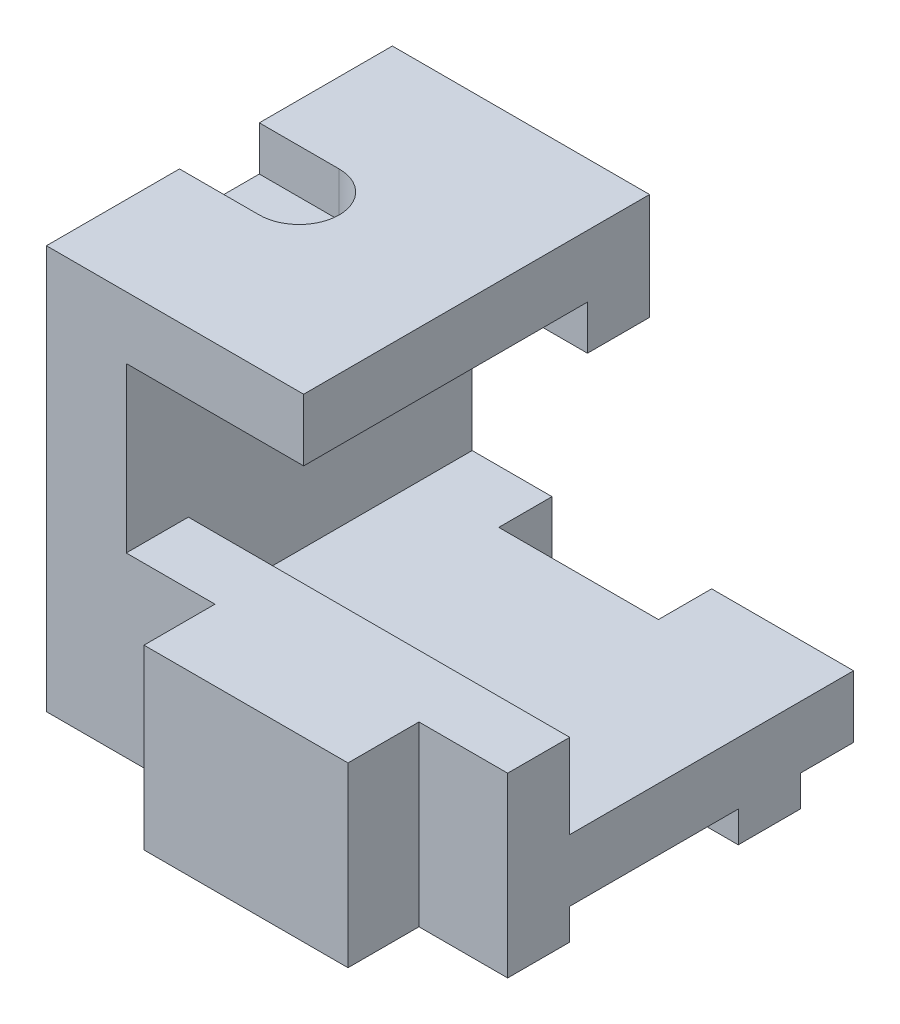
ISO-10303-21;
HEADER;
FILE_DESCRIPTION(('STEP AP214'),'2;1');
FILE_NAME('part.step','',(''),(''),'','','');
FILE_SCHEMA(('AUTOMOTIVE_DESIGN { 1 0 10303 214 1 1 1 1 }'));
ENDSEC;
DATA;
#1=APPLICATION_CONTEXT('core data for automotive mechanical design processes');
#2=APPLICATION_PROTOCOL_DEFINITION('international standard','automotive_design',2000,#1);
#3=PRODUCT_CONTEXT('',#1,'mechanical');
#4=PRODUCT('Part','Part','',(#3));
#5=PRODUCT_RELATED_PRODUCT_CATEGORY('part','',(#4));
#6=PRODUCT_DEFINITION_FORMATION('','',#4);
#7=PRODUCT_DEFINITION_CONTEXT('part definition',#1,'design');
#8=PRODUCT_DEFINITION('design','',#6,#7);
#9=PRODUCT_DEFINITION_SHAPE('','',#8);
#10=(LENGTH_UNIT() NAMED_UNIT(*) SI_UNIT(.MILLI.,.METRE.));
#11=(NAMED_UNIT(*) PLANE_ANGLE_UNIT() SI_UNIT($,.RADIAN.));
#12=(NAMED_UNIT(*) SI_UNIT($,.STERADIAN.) SOLID_ANGLE_UNIT());
#13=UNCERTAINTY_MEASURE_WITH_UNIT(LENGTH_MEASURE(1.E-05),#10,'distance_accuracy_value','');
#14=(GEOMETRIC_REPRESENTATION_CONTEXT(3) GLOBAL_UNCERTAINTY_ASSIGNED_CONTEXT((#13)) GLOBAL_UNIT_ASSIGNED_CONTEXT((#10,
#11,#12)) REPRESENTATION_CONTEXT('',''));
#15=CARTESIAN_POINT('',(0.,0.,0.));
#16=DIRECTION('',(0.,0.,1.));
#17=DIRECTION('',(1.,0.,0.));
#18=AXIS2_PLACEMENT_3D('',#15,#16,#17);
#19=CARTESIAN_POINT('',(7.00000000000001,0.,39.));
#20=DIRECTION('',(-1.,0.,0.));
#21=DIRECTION('',(0.,-1.,0.));
#22=AXIS2_PLACEMENT_3D('',#19,#20,#21);
#23=PLANE('',#22);
#24=DIRECTION('',(0.,0.,1.));
#25=VECTOR('',#24,1.);
#26=CARTESIAN_POINT('',(7.,9.5,32.));
#27=LINE('',#26,#25);
#28=CARTESIAN_POINT('',(7.,9.5,32.));
#29=VERTEX_POINT('',#28);
#30=CARTESIAN_POINT('',(7.,9.5,39.));
#31=VERTEX_POINT('',#30);
#32=EDGE_CURVE('E247',#29,#31,#27,.T.);
#33=ORIENTED_EDGE('',*,*,#32,.F.);
#34=DIRECTION('',(0.,-1.,0.));
#35=VECTOR('',#34,1.);
#36=CARTESIAN_POINT('',(7.00000000000001,0.,32.));
#37=LINE('',#36,#35);
#38=CARTESIAN_POINT('',(7.00000000000001,0.,32.));
#39=VERTEX_POINT('',#38);
#40=EDGE_CURVE('E11',#29,#39,#37,.T.);
#41=ORIENTED_EDGE('',*,*,#40,.T.);
#42=DIRECTION('',(0.,0.,-1.));
#43=VECTOR('',#42,1.);
#44=CARTESIAN_POINT('',(7.00000000000001,0.,39.));
#45=LINE('',#44,#43);
#46=CARTESIAN_POINT('',(7.00000000000001,0.,0.));
#47=VERTEX_POINT('',#46);
#48=EDGE_CURVE('E435',#39,#47,#45,.T.);
#49=ORIENTED_EDGE('',*,*,#48,.T.);
#50=DIRECTION('',(0.,1.,0.));
#51=VECTOR('',#50,1.);
#52=CARTESIAN_POINT('',(7.00000000000001,0.,0.));
#53=LINE('',#52,#51);
#54=CARTESIAN_POINT('',(7.,23.,0.));
#55=VERTEX_POINT('',#54);
#56=EDGE_CURVE('E404',#47,#55,#53,.T.);
#57=ORIENTED_EDGE('',*,*,#56,.T.);
#58=DIRECTION('',(0.,0.,-1.));
#59=VECTOR('',#58,1.);
#60=CARTESIAN_POINT('',(7.000000000005,23.,0.));
#61=LINE('',#60,#59);
#62=CARTESIAN_POINT('',(7.,23.,7.00000000000001));
#63=VERTEX_POINT('',#62);
#64=EDGE_CURVE('E363',#63,#55,#61,.T.);
#65=ORIENTED_EDGE('',*,*,#64,.F.);
#66=DIRECTION('',(0.,-1.,0.));
#67=VECTOR('',#66,1.);
#68=CARTESIAN_POINT('',(7.000000000005,28.0000000000744,7.00000000000001));
#69=LINE('',#68,#67);
#70=CARTESIAN_POINT('',(7.,28.,7.00000000000001));
#71=VERTEX_POINT('',#70);
#72=EDGE_CURVE('E360',#71,#63,#69,.T.);
#73=ORIENTED_EDGE('',*,*,#72,.F.);
#74=DIRECTION('',(0.,0.,-1.));
#75=VECTOR('',#74,1.);
#76=CARTESIAN_POINT('',(7.,28.,39.));
#77=LINE('',#76,#75);
#78=CARTESIAN_POINT('',(7.,28.,39.));
#79=VERTEX_POINT('',#78);
#80=EDGE_CURVE('E432',#79,#71,#77,.T.);
#81=ORIENTED_EDGE('',*,*,#80,.F.);
#82=DIRECTION('',(0.,1.,0.));
#83=VECTOR('',#82,1.);
#84=CARTESIAN_POINT('',(7.00000000000001,0.,39.));
#85=LINE('',#84,#83);
#86=EDGE_CURVE('E255',#31,#79,#85,.T.);
#87=ORIENTED_EDGE('',*,*,#86,.F.);
#88=EDGE_LOOP('',(#33,#41,#49,#57,#65,#73,#81,#87));
#89=FACE_BOUND('',#88,.T.);
#90=ADVANCED_FACE('F36',(#89),#23,.F.);
#91=CARTESIAN_POINT('',(0.,0.,39.));
#92=DIRECTION('',(0.,0.,1.));
#93=DIRECTION('',(1.,0.,0.));
#94=AXIS2_PLACEMENT_3D('',#91,#92,#93);
#95=PLANE('',#94);
#96=DIRECTION('',(0.,1.,0.));
#97=VECTOR('',#96,1.);
#98=CARTESIAN_POINT('',(40.,-10.5,39.));
#99=LINE('',#98,#97);
#100=CARTESIAN_POINT('',(40.,-10.5,39.));
#101=VERTEX_POINT('',#100);
#102=CARTESIAN_POINT('',(40.,9.5,39.));
#103=VERTEX_POINT('',#102);
#104=EDGE_CURVE('E53',#101,#103,#99,.T.);
#105=ORIENTED_EDGE('',*,*,#104,.F.);
#106=DIRECTION('',(1.,0.,0.));
#107=VECTOR('',#106,1.);
#108=CARTESIAN_POINT('',(-15.6524758424985,-10.5,39.));
#109=LINE('',#108,#107);
#110=CARTESIAN_POINT('',(50.,-10.5,39.));
#111=VERTEX_POINT('',#110);
#112=EDGE_CURVE('E346',#101,#111,#109,.T.);
#113=ORIENTED_EDGE('',*,*,#112,.T.);
#114=DIRECTION('',(0.,-1.,0.));
#115=VECTOR('',#114,1.);
#116=CARTESIAN_POINT('',(50.,0.,39.));
#117=LINE('',#116,#115);
#118=CARTESIAN_POINT('',(50.,9.5,39.));
#119=VERTEX_POINT('',#118);
#120=EDGE_CURVE('E407',#119,#111,#117,.T.);
#121=ORIENTED_EDGE('',*,*,#120,.F.);
#122=DIRECTION('',(1.,0.,0.));
#123=VECTOR('',#122,1.);
#124=CARTESIAN_POINT('',(40.,9.5,39.));
#125=LINE('',#124,#123);
#126=EDGE_CURVE('E269',#103,#119,#125,.T.);
#127=ORIENTED_EDGE('',*,*,#126,.F.);
#128=EDGE_LOOP('',(#105,#113,#121,#127));
#129=FACE_BOUND('',#128,.T.);
#130=ADVANCED_FACE('F529',(#129),#95,.T.);
#131=CARTESIAN_POINT('',(0.,-7.,39.));
#132=DIRECTION('',(0.,1.,0.));
#133=DIRECTION('',(0.,0.,1.));
#134=AXIS2_PLACEMENT_3D('',#131,#132,#133);
#135=PLANE('',#134);
#136=DIRECTION('',(1.,0.,0.));
#137=VECTOR('',#136,1.);
#138=CARTESIAN_POINT('',(0.,-7.,0.));
#139=LINE('',#138,#137);
#140=CARTESIAN_POINT('',(-2.,-7.,0.));
#141=VERTEX_POINT('',#140);
#142=CARTESIAN_POINT('',(16.,-7.,0.));
#143=VERTEX_POINT('',#142);
#144=EDGE_CURVE('E419',#141,#143,#139,.T.);
#145=ORIENTED_EDGE('',*,*,#144,.T.);
#146=DIRECTION('',(0.,0.,-1.));
#147=VECTOR('',#146,1.);
#148=CARTESIAN_POINT('',(16.,-7.,0.));
#149=LINE('',#148,#147);
#150=CARTESIAN_POINT('',(16.,-7.,6.00000000000001));
#151=VERTEX_POINT('',#150);
#152=EDGE_CURVE('E466',#151,#143,#149,.T.);
#153=ORIENTED_EDGE('',*,*,#152,.F.);
#154=DIRECTION('',(1.,0.,0.));
#155=VECTOR('',#154,1.);
#156=CARTESIAN_POINT('',(-15.6524758424985,-7.,6.));
#157=LINE('',#156,#155);
#158=CARTESIAN_POINT('',(-2.,-7.,6.));
#159=VERTEX_POINT('',#158);
#160=EDGE_CURVE('E465',#159,#151,#157,.T.);
#161=ORIENTED_EDGE('',*,*,#160,.F.);
#162=DIRECTION('',(0.,0.,1.));
#163=VECTOR('',#162,1.);
#164=CARTESIAN_POINT('',(-2.,-7.,0.));
#165=LINE('',#164,#163);
#166=EDGE_CURVE('E296',#141,#159,#165,.T.);
#167=ORIENTED_EDGE('',*,*,#166,.F.);
#168=EDGE_LOOP('',(#145,#153,#161,#167));
#169=FACE_BOUND('',#168,.T.);
#170=ADVANCED_FACE('F462',(#169),#135,.F.);
#171=CARTESIAN_POINT('',(0.,0.,0.));
#172=DIRECTION('',(0.,0.,1.));
#173=DIRECTION('',(1.,0.,0.));
#174=AXIS2_PLACEMENT_3D('',#171,#172,#173);
#175=PLANE('',#174);
#176=DIRECTION('',(1.,0.,0.));
#177=VECTOR('',#176,1.);
#178=CARTESIAN_POINT('',(0.,0.,0.));
#179=LINE('',#178,#177);
#180=CARTESIAN_POINT('',(16.,0.,0.));
#181=VERTEX_POINT('',#180);
#182=EDGE_CURVE('E426',#47,#181,#179,.T.);
#183=ORIENTED_EDGE('',*,*,#182,.T.);
#184=DIRECTION('',(0.,-1.,0.));
#185=VECTOR('',#184,1.);
#186=CARTESIAN_POINT('',(16.,35.001,0.));
#187=LINE('',#186,#185);
#188=EDGE_CURVE('E341',#181,#143,#187,.T.);
#189=ORIENTED_EDGE('',*,*,#188,.T.);
#190=ORIENTED_EDGE('',*,*,#144,.F.);
#191=DIRECTION('',(0.,-1.,0.));
#192=VECTOR('',#191,1.);
#193=CARTESIAN_POINT('',(-2.,35.,0.));
#194=LINE('',#193,#192);
#195=CARTESIAN_POINT('',(-2.,35.,0.));
#196=VERTEX_POINT('',#195);
#197=EDGE_CURVE('E293',#196,#141,#194,.T.);
#198=ORIENTED_EDGE('',*,*,#197,.F.);
#199=DIRECTION('',(1.,0.,0.));
#200=VECTOR('',#199,1.);
#201=CARTESIAN_POINT('',(0.,35.,0.));
#202=LINE('',#201,#200);
#203=CARTESIAN_POINT('',(27.,35.,0.));
#204=VERTEX_POINT('',#203);
#205=EDGE_CURVE('E415',#196,#204,#202,.T.);
#206=ORIENTED_EDGE('',*,*,#205,.T.);
#207=DIRECTION('',(0.,-1.,0.));
#208=VECTOR('',#207,1.);
#209=CARTESIAN_POINT('',(27.,0.,0.));
#210=LINE('',#209,#208);
#211=CARTESIAN_POINT('',(27.,23.,0.));
#212=VERTEX_POINT('',#211);
#213=EDGE_CURVE('E398',#204,#212,#210,.T.);
#214=ORIENTED_EDGE('',*,*,#213,.T.);
#215=DIRECTION('',(1.,0.,0.));
#216=VECTOR('',#215,1.);
#217=CARTESIAN_POINT('',(-500000.,23.,0.));
#218=LINE('',#217,#216);
#219=EDGE_CURVE('E374',#55,#212,#218,.T.);
#220=ORIENTED_EDGE('',*,*,#219,.F.);
#221=ORIENTED_EDGE('',*,*,#56,.F.);
#222=EDGE_LOOP('',(#183,#189,#190,#198,#206,#214,#220,#221));
#223=FACE_BOUND('',#222,.T.);
#224=ADVANCED_FACE('F455',(#223),#175,.F.);
#225=CARTESIAN_POINT('',(34.,-7.,6.));
#226=VERTEX_POINT('',#225);
#227=CARTESIAN_POINT('',(50.,-7.,6.));
#228=VERTEX_POINT('',#227);
#229=EDGE_CURVE('E470',#226,#228,#157,.T.);
#230=ORIENTED_EDGE('',*,*,#229,.F.);
#231=DIRECTION('',(0.,0.,1.));
#232=VECTOR('',#231,1.);
#233=CARTESIAN_POINT('',(34.,-7.,0.));
#234=LINE('',#233,#232);
#235=CARTESIAN_POINT('',(34.,-7.,0.));
#236=VERTEX_POINT('',#235);
#237=EDGE_CURVE('E61',#236,#226,#234,.T.);
#238=ORIENTED_EDGE('',*,*,#237,.F.);
#239=CARTESIAN_POINT('',(50.,-7.,0.));
#240=VERTEX_POINT('',#239);
#241=EDGE_CURVE('E418',#236,#240,#139,.T.);
#242=ORIENTED_EDGE('',*,*,#241,.T.);
#243=DIRECTION('',(0.,0.,-1.));
#244=VECTOR('',#243,1.);
#245=CARTESIAN_POINT('',(50.,-7.,39.));
#246=LINE('',#245,#244);
#247=EDGE_CURVE('E440',#228,#240,#246,.T.);
#248=ORIENTED_EDGE('',*,*,#247,.F.);
#249=EDGE_LOOP('',(#230,#238,#242,#248));
#250=FACE_BOUND('',#249,.T.);
#251=ADVANCED_FACE('F545',(#250),#135,.F.);
#252=CARTESIAN_POINT('',(27.,0.,39.));
#253=DIRECTION('',(1.,0.,0.));
#254=DIRECTION('',(0.,1.,0.));
#255=AXIS2_PLACEMENT_3D('',#252,#253,#254);
#256=PLANE('',#255);
#257=ORIENTED_EDGE('',*,*,#213,.F.);
#258=DIRECTION('',(0.,0.,-1.));
#259=VECTOR('',#258,1.);
#260=CARTESIAN_POINT('',(27.,35.,39.));
#261=LINE('',#260,#259);
#262=CARTESIAN_POINT('',(27.,35.,39.));
#263=VERTEX_POINT('',#262);
#264=EDGE_CURVE('E45',#263,#204,#261,.T.);
#265=ORIENTED_EDGE('',*,*,#264,.F.);
#266=DIRECTION('',(0.,-1.,0.));
#267=VECTOR('',#266,1.);
#268=CARTESIAN_POINT('',(27.,0.,39.));
#269=LINE('',#268,#267);
#270=CARTESIAN_POINT('',(27.,28.,39.));
#271=VERTEX_POINT('',#270);
#272=EDGE_CURVE('E400',#263,#271,#269,.T.);
#273=ORIENTED_EDGE('',*,*,#272,.T.);
#274=DIRECTION('',(0.,0.,-1.));
#275=VECTOR('',#274,1.);
#276=CARTESIAN_POINT('',(27.,28.,39.));
#277=LINE('',#276,#275);
#278=CARTESIAN_POINT('',(27.,28.,7.00000000000001));
#279=VERTEX_POINT('',#278);
#280=EDGE_CURVE('E413',#271,#279,#277,.T.);
#281=ORIENTED_EDGE('',*,*,#280,.T.);
#282=DIRECTION('',(0.,-1.,0.));
#283=VECTOR('',#282,1.);
#284=CARTESIAN_POINT('',(27.,28.,7.00000000000001));
#285=LINE('',#284,#283);
#286=CARTESIAN_POINT('',(27.,23.,7.00000000000001));
#287=VERTEX_POINT('',#286);
#288=EDGE_CURVE('E371',#279,#287,#285,.T.);
#289=ORIENTED_EDGE('',*,*,#288,.T.);
#290=DIRECTION('',(0.,0.,-1.));
#291=VECTOR('',#290,1.);
#292=CARTESIAN_POINT('',(27.,23.,0.));
#293=LINE('',#292,#291);
#294=EDGE_CURVE('E367',#287,#212,#293,.T.);
#295=ORIENTED_EDGE('',*,*,#294,.T.);
#296=EDGE_LOOP('',(#257,#265,#273,#281,#289,#295));
#297=FACE_BOUND('',#296,.T.);
#298=ADVANCED_FACE('F38',(#297),#256,.T.);
#299=CARTESIAN_POINT('',(0.,35.,39.));
#300=DIRECTION('',(0.,1.,0.));
#301=DIRECTION('',(0.,0.,1.));
#302=AXIS2_PLACEMENT_3D('',#299,#300,#301);
#303=PLANE('',#302);
#304=DIRECTION('',(1.,0.,0.));
#305=VECTOR('',#304,1.);
#306=CARTESIAN_POINT('',(0.,35.,24.));
#307=LINE('',#306,#305);
#308=CARTESIAN_POINT('',(-2.,35.,24.));
#309=VERTEX_POINT('',#308);
#310=CARTESIAN_POINT('',(7.,35.,24.));
#311=VERTEX_POINT('',#310);
#312=EDGE_CURVE('E384',#309,#311,#307,.T.);
#313=ORIENTED_EDGE('',*,*,#312,.F.);
#314=DIRECTION('',(0.,0.,-1.));
#315=VECTOR('',#314,1.);
#316=CARTESIAN_POINT('',(-2.,35.,39.));
#317=LINE('',#316,#315);
#318=CARTESIAN_POINT('',(-2.,35.,39.));
#319=VERTEX_POINT('',#318);
#320=EDGE_CURVE('E278',#319,#309,#317,.T.);
#321=ORIENTED_EDGE('',*,*,#320,.F.);
#322=DIRECTION('',(1.,0.,0.));
#323=VECTOR('',#322,1.);
#324=CARTESIAN_POINT('',(0.,35.,39.));
#325=LINE('',#324,#323);
#326=EDGE_CURVE('E403',#319,#263,#325,.T.);
#327=ORIENTED_EDGE('',*,*,#326,.T.);
#328=ORIENTED_EDGE('',*,*,#264,.T.);
#329=ORIENTED_EDGE('',*,*,#205,.F.);
#330=DIRECTION('',(0.,0.,-1.));
#331=VECTOR('',#330,1.);
#332=CARTESIAN_POINT('',(-2.,35.,15.));
#333=LINE('',#332,#331);
#334=CARTESIAN_POINT('',(-2.,35.,15.));
#335=VERTEX_POINT('',#334);
#336=EDGE_CURVE('E290',#335,#196,#333,.T.);
#337=ORIENTED_EDGE('',*,*,#336,.F.);
#338=DIRECTION('',(-1.,0.,0.));
#339=VECTOR('',#338,1.);
#340=CARTESIAN_POINT('',(0.,35.,15.));
#341=LINE('',#340,#339);
#342=CARTESIAN_POINT('',(7.,35.,15.));
#343=VERTEX_POINT('',#342);
#344=EDGE_CURVE('E392',#343,#335,#341,.T.);
#345=ORIENTED_EDGE('',*,*,#344,.F.);
#346=CARTESIAN_POINT('',(7.,35.,19.5));
#347=DIRECTION('',(0.,1.,0.));
#348=DIRECTION('',(0.,0.,1.));
#349=AXIS2_PLACEMENT_3D('',#346,#347,#348);
#350=CIRCLE('',#349,4.5);
#351=EDGE_CURVE('E370',#311,#343,#350,.T.);
#352=ORIENTED_EDGE('',*,*,#351,.F.);
#353=EDGE_LOOP('',(#313,#321,#327,#328,#329,#337,#345,#352));
#354=FACE_BOUND('',#353,.T.);
#355=ADVANCED_FACE('F446',(#354),#303,.T.);
#356=DIRECTION('',(-1.,0.,0.));
#357=VECTOR('',#356,1.);
#358=CARTESIAN_POINT('',(0.,-7.,32.));
#359=LINE('',#358,#357);
#360=CARTESIAN_POINT('',(50.,-7.,32.));
#361=VERTEX_POINT('',#360);
#362=CARTESIAN_POINT('',(-2.,-7.,32.));
#363=VERTEX_POINT('',#362);
#364=EDGE_CURVE('E358',#361,#363,#359,.T.);
#365=ORIENTED_EDGE('',*,*,#364,.T.);
#366=DIRECTION('',(0.,0.,1.));
#367=VECTOR('',#366,1.);
#368=CARTESIAN_POINT('',(-2.,-7.,13.));
#369=LINE('',#368,#367);
#370=CARTESIAN_POINT('',(-2.,-7.,13.));
#371=VERTEX_POINT('',#370);
#372=EDGE_CURVE('E308',#371,#363,#369,.T.);
#373=ORIENTED_EDGE('',*,*,#372,.F.);
#374=DIRECTION('',(1.,0.,0.));
#375=VECTOR('',#374,1.);
#376=CARTESIAN_POINT('',(-15.6524758424985,-7.,13.));
#377=LINE('',#376,#375);
#378=CARTESIAN_POINT('',(50.,-7.,13.));
#379=VERTEX_POINT('',#378);
#380=EDGE_CURVE('E469',#371,#379,#377,.T.);
#381=ORIENTED_EDGE('',*,*,#380,.T.);
#382=EDGE_CURVE('E441',#361,#379,#246,.T.);
#383=ORIENTED_EDGE('',*,*,#382,.F.);
#384=EDGE_LOOP('',(#365,#373,#381,#383));
#385=FACE_BOUND('',#384,.T.);
#386=ADVANCED_FACE('F542',(#385),#135,.F.);
#387=CARTESIAN_POINT('',(50.,0.,39.));
#388=DIRECTION('',(1.,0.,0.));
#389=DIRECTION('',(0.,0.,-1.));
#390=AXIS2_PLACEMENT_3D('',#387,#388,#389);
#391=PLANE('',#390);
#392=DIRECTION('',(0.,0.,-1.));
#393=VECTOR('',#392,1.);
#394=CARTESIAN_POINT('',(50.,0.,39.));
#395=LINE('',#394,#393);
#396=CARTESIAN_POINT('',(50.,0.,32.));
#397=VERTEX_POINT('',#396);
#398=CARTESIAN_POINT('',(50.,0.,0.));
#399=VERTEX_POINT('',#398);
#400=EDGE_CURVE('E437',#397,#399,#395,.T.);
#401=ORIENTED_EDGE('',*,*,#400,.F.);
#402=DIRECTION('',(0.,1.,0.));
#403=VECTOR('',#402,1.);
#404=CARTESIAN_POINT('',(50.,-10.5,32.));
#405=LINE('',#404,#403);
#406=CARTESIAN_POINT('',(50.,9.5,32.));
#407=VERTEX_POINT('',#406);
#408=EDGE_CURVE('E481',#397,#407,#405,.T.);
#409=ORIENTED_EDGE('',*,*,#408,.T.);
#410=DIRECTION('',(0.,0.,-1.));
#411=VECTOR('',#410,1.);
#412=CARTESIAN_POINT('',(50.,9.5,39.));
#413=LINE('',#412,#411);
#414=EDGE_CURVE('E251',#119,#407,#413,.T.);
#415=ORIENTED_EDGE('',*,*,#414,.F.);
#416=ORIENTED_EDGE('',*,*,#120,.T.);
#417=DIRECTION('',(0.,0.,-1.));
#418=VECTOR('',#417,1.);
#419=CARTESIAN_POINT('',(50.,-10.5,39.));
#420=LINE('',#419,#418);
#421=CARTESIAN_POINT('',(50.,-10.5,32.));
#422=VERTEX_POINT('',#421);
#423=EDGE_CURVE('E350',#111,#422,#420,.T.);
#424=ORIENTED_EDGE('',*,*,#423,.T.);
#425=EDGE_CURVE('E483',#422,#361,#405,.T.);
#426=ORIENTED_EDGE('',*,*,#425,.T.);
#427=ORIENTED_EDGE('',*,*,#382,.T.);
#428=DIRECTION('',(0.,-1.,0.));
#429=VECTOR('',#428,1.);
#430=CARTESIAN_POINT('',(50.,-7.,13.));
#431=LINE('',#430,#429);
#432=CARTESIAN_POINT('',(50.,-10.5,13.));
#433=VERTEX_POINT('',#432);
#434=EDGE_CURVE('E895',#379,#433,#431,.T.);
#435=ORIENTED_EDGE('',*,*,#434,.T.);
#436=DIRECTION('',(0.,0.,-1.));
#437=VECTOR('',#436,1.);
#438=CARTESIAN_POINT('',(50.,-10.5,13.));
#439=LINE('',#438,#437);
#440=CARTESIAN_POINT('',(50.,-10.5,6.));
#441=VERTEX_POINT('',#440);
#442=EDGE_CURVE('E898',#433,#441,#439,.T.);
#443=ORIENTED_EDGE('',*,*,#442,.T.);
#444=DIRECTION('',(0.,1.,0.));
#445=VECTOR('',#444,1.);
#446=CARTESIAN_POINT('',(50.,-7.,6.));
#447=LINE('',#446,#445);
#448=EDGE_CURVE('E479',#441,#228,#447,.T.);
#449=ORIENTED_EDGE('',*,*,#448,.T.);
#450=ORIENTED_EDGE('',*,*,#247,.T.);
#451=DIRECTION('',(0.,-1.,0.));
#452=VECTOR('',#451,1.);
#453=CARTESIAN_POINT('',(50.,0.,0.));
#454=LINE('',#453,#452);
#455=EDGE_CURVE('E422',#399,#240,#454,.T.);
#456=ORIENTED_EDGE('',*,*,#455,.F.);
#457=EDGE_LOOP('',(#401,#409,#415,#416,#424,#426,#427,#435,#443,#449,#450,#456));
#458=FACE_BOUND('',#457,.T.);
#459=ADVANCED_FACE('F489',(#458),#391,.T.);
#460=CARTESIAN_POINT('',(0.,0.,39.));
#461=DIRECTION('',(0.,1.,0.));
#462=DIRECTION('',(0.,0.,1.));
#463=AXIS2_PLACEMENT_3D('',#460,#461,#462);
#464=PLANE('',#463);
#465=DIRECTION('',(0.,0.,-1.));
#466=VECTOR('',#465,1.);
#467=CARTESIAN_POINT('',(16.,0.,0.));
#468=LINE('',#467,#466);
#469=CARTESIAN_POINT('',(16.,0.,6.00000000000001));
#470=VERTEX_POINT('',#469);
#471=EDGE_CURVE('E336',#470,#181,#468,.T.);
#472=ORIENTED_EDGE('',*,*,#471,.T.);
#473=ORIENTED_EDGE('',*,*,#182,.F.);
#474=ORIENTED_EDGE('',*,*,#48,.F.);
#475=DIRECTION('',(-1.,0.,0.));
#476=VECTOR('',#475,1.);
#477=CARTESIAN_POINT('',(0.,0.,32.));
#478=LINE('',#477,#476);
#479=EDGE_CURVE('E239',#397,#39,#478,.T.);
#480=ORIENTED_EDGE('',*,*,#479,.F.);
#481=ORIENTED_EDGE('',*,*,#400,.T.);
#482=CARTESIAN_POINT('',(34.,0.,0.));
#483=VERTEX_POINT('',#482);
#484=EDGE_CURVE('E425',#483,#399,#179,.T.);
#485=ORIENTED_EDGE('',*,*,#484,.F.);
#486=DIRECTION('',(0.,0.,1.));
#487=VECTOR('',#486,1.);
#488=CARTESIAN_POINT('',(34.,0.,0.));
#489=LINE('',#488,#487);
#490=CARTESIAN_POINT('',(34.,0.,6.00000000000001));
#491=VERTEX_POINT('',#490);
#492=EDGE_CURVE('E908',#483,#491,#489,.T.);
#493=ORIENTED_EDGE('',*,*,#492,.T.);
#494=DIRECTION('',(-1.,0.,0.));
#495=VECTOR('',#494,1.);
#496=CARTESIAN_POINT('',(34.,0.,6.00000000000001));
#497=LINE('',#496,#495);
#498=EDGE_CURVE('E904',#491,#470,#497,.T.);
#499=ORIENTED_EDGE('',*,*,#498,.T.);
#500=EDGE_LOOP('',(#472,#473,#474,#480,#481,#485,#493,#499));
#501=FACE_BOUND('',#500,.T.);
#502=ADVANCED_FACE('F492',(#501),#464,.T.);
#503=CARTESIAN_POINT('',(0.,28.,39.));
#504=DIRECTION('',(0.,1.,0.));
#505=DIRECTION('',(-1.,0.,0.));
#506=AXIS2_PLACEMENT_3D('',#503,#504,#505);
#507=PLANE('',#506);
#508=ORIENTED_EDGE('',*,*,#80,.T.);
#509=DIRECTION('',(1.,0.,0.));
#510=VECTOR('',#509,1.);
#511=CARTESIAN_POINT('',(-500000.,28.,7.00000000000001));
#512=LINE('',#511,#510);
#513=EDGE_CURVE('E366',#71,#279,#512,.T.);
#514=ORIENTED_EDGE('',*,*,#513,.T.);
#515=ORIENTED_EDGE('',*,*,#280,.F.);
#516=DIRECTION('',(1.,0.,0.));
#517=VECTOR('',#516,1.);
#518=CARTESIAN_POINT('',(0.,28.,39.));
#519=LINE('',#518,#517);
#520=EDGE_CURVE('E411',#79,#271,#519,.T.);
#521=ORIENTED_EDGE('',*,*,#520,.F.);
#522=EDGE_LOOP('',(#508,#514,#515,#521));
#523=FACE_BOUND('',#522,.T.);
#524=ADVANCED_FACE('F505',(#523),#507,.F.);
#525=DIRECTION('',(1.,0.,0.));
#526=VECTOR('',#525,1.);
#527=CARTESIAN_POINT('',(7.,9.5,39.));
#528=LINE('',#527,#526);
#529=CARTESIAN_POINT('',(17.,9.5,39.));
#530=VERTEX_POINT('',#529);
#531=EDGE_CURVE('E256',#31,#530,#528,.T.);
#532=ORIENTED_EDGE('',*,*,#531,.F.);
#533=ORIENTED_EDGE('',*,*,#86,.T.);
#534=ORIENTED_EDGE('',*,*,#520,.T.);
#535=ORIENTED_EDGE('',*,*,#272,.F.);
#536=ORIENTED_EDGE('',*,*,#326,.F.);
#537=DIRECTION('',(0.,1.,0.));
#538=VECTOR('',#537,1.);
#539=CARTESIAN_POINT('',(-2.,-10.5,39.));
#540=LINE('',#539,#538);
#541=CARTESIAN_POINT('',(-2.,-10.5,39.));
#542=VERTEX_POINT('',#541);
#543=EDGE_CURVE('E275',#542,#319,#540,.T.);
#544=ORIENTED_EDGE('',*,*,#543,.F.);
#545=CARTESIAN_POINT('',(17.,-10.5,39.));
#546=VERTEX_POINT('',#545);
#547=EDGE_CURVE('E349',#542,#546,#109,.T.);
#548=ORIENTED_EDGE('',*,*,#547,.T.);
#549=DIRECTION('',(0.,-1.,0.));
#550=VECTOR('',#549,1.);
#551=CARTESIAN_POINT('',(17.,-10.5,39.));
#552=LINE('',#551,#550);
#553=EDGE_CURVE('E317',#530,#546,#552,.T.);
#554=ORIENTED_EDGE('',*,*,#553,.F.);
#555=EDGE_LOOP('',(#532,#533,#534,#535,#536,#544,#548,#554));
#556=FACE_BOUND('',#555,.T.);
#557=ADVANCED_FACE('F508',(#556),#95,.T.);
#558=ORIENTED_EDGE('',*,*,#241,.F.);
#559=DIRECTION('',(0.,-1.,0.));
#560=VECTOR('',#559,1.);
#561=CARTESIAN_POINT('',(34.,35.001,0.));
#562=LINE('',#561,#560);
#563=EDGE_CURVE('E907',#483,#236,#562,.T.);
#564=ORIENTED_EDGE('',*,*,#563,.F.);
#565=ORIENTED_EDGE('',*,*,#484,.T.);
#566=ORIENTED_EDGE('',*,*,#455,.T.);
#567=EDGE_LOOP('',(#558,#564,#565,#566));
#568=FACE_BOUND('',#567,.T.);
#569=ADVANCED_FACE('F557',(#568),#175,.F.);
#570=CARTESIAN_POINT('',(7.,30.,19.5));
#571=DIRECTION('',(0.,1.,0.));
#572=DIRECTION('',(0.,0.,1.));
#573=AXIS2_PLACEMENT_3D('',#570,#571,#572);
#574=CYLINDRICAL_SURFACE('',#573,4.5);
#575=ORIENTED_EDGE('',*,*,#351,.T.);
#576=DIRECTION('',(0.,1.,0.));
#577=VECTOR('',#576,1.);
#578=CARTESIAN_POINT('',(7.,30.,15.));
#579=LINE('',#578,#577);
#580=CARTESIAN_POINT('',(7.,30.,15.));
#581=VERTEX_POINT('',#580);
#582=EDGE_CURVE('E389',#581,#343,#579,.T.);
#583=ORIENTED_EDGE('',*,*,#582,.F.);
#584=CARTESIAN_POINT('',(7.,30.,19.5));
#585=DIRECTION('',(0.,1.,0.));
#586=DIRECTION('',(0.,0.,1.));
#587=AXIS2_PLACEMENT_3D('',#584,#585,#586);
#588=CIRCLE('',#587,4.5);
#589=CARTESIAN_POINT('',(7.,30.,24.));
#590=VERTEX_POINT('',#589);
#591=EDGE_CURVE('E380',#590,#581,#588,.T.);
#592=ORIENTED_EDGE('',*,*,#591,.F.);
#593=DIRECTION('',(0.,1.,0.));
#594=VECTOR('',#593,1.);
#595=CARTESIAN_POINT('',(7.,30.,24.));
#596=LINE('',#595,#594);
#597=EDGE_CURVE('E396',#590,#311,#596,.T.);
#598=ORIENTED_EDGE('',*,*,#597,.T.);
#599=EDGE_LOOP('',(#575,#583,#592,#598));
#600=FACE_BOUND('',#599,.T.);
#601=ADVANCED_FACE('F594',(#600),#574,.F.);
#602=CARTESIAN_POINT('',(0.,30.,24.));
#603=DIRECTION('',(0.,0.,1.));
#604=DIRECTION('',(1.,0.,0.));
#605=AXIS2_PLACEMENT_3D('',#602,#603,#604);
#606=PLANE('',#605);
#607=ORIENTED_EDGE('',*,*,#312,.T.);
#608=ORIENTED_EDGE('',*,*,#597,.F.);
#609=DIRECTION('',(1.,0.,0.));
#610=VECTOR('',#609,1.);
#611=CARTESIAN_POINT('',(0.,30.,24.));
#612=LINE('',#611,#610);
#613=CARTESIAN_POINT('',(-2.,30.,24.));
#614=VERTEX_POINT('',#613);
#615=EDGE_CURVE('E386',#614,#590,#612,.T.);
#616=ORIENTED_EDGE('',*,*,#615,.F.);
#617=DIRECTION('',(0.,-1.,0.));
#618=VECTOR('',#617,1.);
#619=CARTESIAN_POINT('',(-2.,35.,24.));
#620=LINE('',#619,#618);
#621=EDGE_CURVE('E281',#309,#614,#620,.T.);
#622=ORIENTED_EDGE('',*,*,#621,.F.);
#623=EDGE_LOOP('',(#607,#608,#616,#622));
#624=FACE_BOUND('',#623,.T.);
#625=ADVANCED_FACE('F588',(#624),#606,.F.);
#626=CARTESIAN_POINT('',(0.,30.,15.));
#627=DIRECTION('',(0.,0.,-1.));
#628=DIRECTION('',(-1.,0.,0.));
#629=AXIS2_PLACEMENT_3D('',#626,#627,#628);
#630=PLANE('',#629);
#631=ORIENTED_EDGE('',*,*,#344,.T.);
#632=DIRECTION('',(0.,1.,0.));
#633=VECTOR('',#632,1.);
#634=CARTESIAN_POINT('',(-2.,30.,15.));
#635=LINE('',#634,#633);
#636=CARTESIAN_POINT('',(-2.,30.,15.));
#637=VERTEX_POINT('',#636);
#638=EDGE_CURVE('E287',#637,#335,#635,.T.);
#639=ORIENTED_EDGE('',*,*,#638,.F.);
#640=DIRECTION('',(-1.,0.,0.));
#641=VECTOR('',#640,1.);
#642=CARTESIAN_POINT('',(0.,30.,15.));
#643=LINE('',#642,#641);
#644=EDGE_CURVE('E383',#581,#637,#643,.T.);
#645=ORIENTED_EDGE('',*,*,#644,.F.);
#646=ORIENTED_EDGE('',*,*,#582,.T.);
#647=EDGE_LOOP('',(#631,#639,#645,#646));
#648=FACE_BOUND('',#647,.T.);
#649=ADVANCED_FACE('F593',(#648),#630,.F.);
#650=CARTESIAN_POINT('',(0.,30.,0.));
#651=DIRECTION('',(0.,1.,0.));
#652=DIRECTION('',(0.,0.,1.));
#653=AXIS2_PLACEMENT_3D('',#650,#651,#652);
#654=PLANE('',#653);
#655=ORIENTED_EDGE('',*,*,#591,.T.);
#656=ORIENTED_EDGE('',*,*,#644,.T.);
#657=DIRECTION('',(0.,0.,-1.));
#658=VECTOR('',#657,1.);
#659=CARTESIAN_POINT('',(-2.,30.,24.));
#660=LINE('',#659,#658);
#661=EDGE_CURVE('E284',#614,#637,#660,.T.);
#662=ORIENTED_EDGE('',*,*,#661,.F.);
#663=ORIENTED_EDGE('',*,*,#615,.T.);
#664=EDGE_LOOP('',(#655,#656,#662,#663));
#665=FACE_BOUND('',#664,.T.);
#666=ADVANCED_FACE('F606',(#665),#654,.T.);
#667=CARTESIAN_POINT('',(-500000.,23.,0.));
#668=DIRECTION('',(0.,-1.,0.));
#669=DIRECTION('',(0.,0.,-1.));
#670=AXIS2_PLACEMENT_3D('',#667,#668,#669);
#671=PLANE('',#670);
#672=DIRECTION('',(1.,0.,0.));
#673=VECTOR('',#672,1.);
#674=CARTESIAN_POINT('',(-500000.,23.,7.00000000000001));
#675=LINE('',#674,#673);
#676=EDGE_CURVE('E376',#63,#287,#675,.T.);
#677=ORIENTED_EDGE('',*,*,#676,.F.);
#678=ORIENTED_EDGE('',*,*,#64,.T.);
#679=ORIENTED_EDGE('',*,*,#219,.T.);
#680=ORIENTED_EDGE('',*,*,#294,.F.);
#681=EDGE_LOOP('',(#677,#678,#679,#680));
#682=FACE_BOUND('',#681,.T.);
#683=ADVANCED_FACE('F498',(#682),#671,.T.);
#684=CARTESIAN_POINT('',(-500000.,28.,7.00000000000001));
#685=DIRECTION('',(0.,0.,1.));
#686=DIRECTION('',(1.,0.,0.));
#687=AXIS2_PLACEMENT_3D('',#684,#685,#686);
#688=PLANE('',#687);
#689=ORIENTED_EDGE('',*,*,#513,.F.);
#690=ORIENTED_EDGE('',*,*,#72,.T.);
#691=ORIENTED_EDGE('',*,*,#676,.T.);
#692=ORIENTED_EDGE('',*,*,#288,.F.);
#693=EDGE_LOOP('',(#689,#690,#691,#692));
#694=FACE_BOUND('',#693,.T.);
#695=ADVANCED_FACE('F501',(#694),#688,.T.);
#696=CARTESIAN_POINT('',(-15.6524758424985,-10.5,32.));
#697=DIRECTION('',(0.,0.,-1.));
#698=DIRECTION('',(-1.,0.,0.));
#699=AXIS2_PLACEMENT_3D('',#696,#697,#698);
#700=PLANE('',#699);
#701=ORIENTED_EDGE('',*,*,#408,.F.);
#702=ORIENTED_EDGE('',*,*,#479,.T.);
#703=ORIENTED_EDGE('',*,*,#40,.F.);
#704=DIRECTION('',(-1.,0.,0.));
#705=VECTOR('',#704,1.);
#706=CARTESIAN_POINT('',(50.,9.5,32.));
#707=LINE('',#706,#705);
#708=EDGE_CURVE('E237',#407,#29,#707,.T.);
#709=ORIENTED_EDGE('',*,*,#708,.F.);
#710=EDGE_LOOP('',(#701,#702,#703,#709));
#711=FACE_BOUND('',#710,.T.);
#712=ADVANCED_FACE('F236',(#711),#700,.T.);
#713=ORIENTED_EDGE('',*,*,#364,.F.);
#714=ORIENTED_EDGE('',*,*,#425,.F.);
#715=DIRECTION('',(1.,0.,0.));
#716=VECTOR('',#715,1.);
#717=CARTESIAN_POINT('',(-15.6524758424985,-10.5,32.));
#718=LINE('',#717,#716);
#719=CARTESIAN_POINT('',(-2.,-10.5,32.));
#720=VERTEX_POINT('',#719);
#721=EDGE_CURVE('E354',#720,#422,#718,.T.);
#722=ORIENTED_EDGE('',*,*,#721,.F.);
#723=DIRECTION('',(0.,-1.,0.));
#724=VECTOR('',#723,1.);
#725=CARTESIAN_POINT('',(-2.,-7.,32.));
#726=LINE('',#725,#724);
#727=EDGE_CURVE('E311',#363,#720,#726,.T.);
#728=ORIENTED_EDGE('',*,*,#727,.F.);
#729=EDGE_LOOP('',(#713,#714,#722,#728));
#730=FACE_BOUND('',#729,.T.);
#731=ADVANCED_FACE('F625',(#730),#700,.T.);
#732=CARTESIAN_POINT('',(-15.6524758424985,-10.5,39.));
#733=DIRECTION('',(0.,-1.,0.));
#734=DIRECTION('',(0.,0.,-1.));
#735=AXIS2_PLACEMENT_3D('',#732,#733,#734);
#736=PLANE('',#735);
#737=ORIENTED_EDGE('',*,*,#547,.F.);
#738=DIRECTION('',(0.,0.,1.));
#739=VECTOR('',#738,1.);
#740=CARTESIAN_POINT('',(-2.,-10.5,32.));
#741=LINE('',#740,#739);
#742=EDGE_CURVE('E272',#720,#542,#741,.T.);
#743=ORIENTED_EDGE('',*,*,#742,.F.);
#744=ORIENTED_EDGE('',*,*,#721,.T.);
#745=ORIENTED_EDGE('',*,*,#423,.F.);
#746=ORIENTED_EDGE('',*,*,#112,.F.);
#747=DIRECTION('',(0.,0.,-1.));
#748=VECTOR('',#747,1.);
#749=CARTESIAN_POINT('',(40.,-10.5,47.));
#750=LINE('',#749,#748);
#751=CARTESIAN_POINT('',(40.,-10.5,47.));
#752=VERTEX_POINT('',#751);
#753=EDGE_CURVE('E321',#752,#101,#750,.T.);
#754=ORIENTED_EDGE('',*,*,#753,.F.);
#755=DIRECTION('',(1.,0.,0.));
#756=VECTOR('',#755,1.);
#757=CARTESIAN_POINT('',(17.,-10.5,47.));
#758=LINE('',#757,#756);
#759=CARTESIAN_POINT('',(17.,-10.5,47.));
#760=VERTEX_POINT('',#759);
#761=EDGE_CURVE('E319',#760,#752,#758,.T.);
#762=ORIENTED_EDGE('',*,*,#761,.F.);
#763=DIRECTION('',(0.,0.,-1.));
#764=VECTOR('',#763,1.);
#765=CARTESIAN_POINT('',(17.,-10.5,47.));
#766=LINE('',#765,#764);
#767=EDGE_CURVE('E331',#760,#546,#766,.T.);
#768=ORIENTED_EDGE('',*,*,#767,.T.);
#769=EDGE_LOOP('',(#737,#743,#744,#745,#746,#754,#762,#768));
#770=FACE_BOUND('',#769,.T.);
#771=ADVANCED_FACE('F629',(#770),#736,.T.);
#772=CARTESIAN_POINT('',(-15.6524758424985,-10.5,13.));
#773=DIRECTION('',(0.,-1.,0.));
#774=DIRECTION('',(0.,0.,-1.));
#775=AXIS2_PLACEMENT_3D('',#772,#773,#774);
#776=PLANE('',#775);
#777=DIRECTION('',(1.,0.,0.));
#778=VECTOR('',#777,1.);
#779=CARTESIAN_POINT('',(-15.6524758424985,-10.5,13.));
#780=LINE('',#779,#778);
#781=CARTESIAN_POINT('',(-2.,-10.5,13.));
#782=VERTEX_POINT('',#781);
#783=EDGE_CURVE('E473',#782,#433,#780,.T.);
#784=ORIENTED_EDGE('',*,*,#783,.F.);
#785=DIRECTION('',(0.,0.,1.));
#786=VECTOR('',#785,1.);
#787=CARTESIAN_POINT('',(-2.,-10.5,6.));
#788=LINE('',#787,#786);
#789=CARTESIAN_POINT('',(-2.,-10.5,6.));
#790=VERTEX_POINT('',#789);
#791=EDGE_CURVE('E302',#790,#782,#788,.T.);
#792=ORIENTED_EDGE('',*,*,#791,.F.);
#793=DIRECTION('',(1.,0.,0.));
#794=VECTOR('',#793,1.);
#795=CARTESIAN_POINT('',(-15.6524758424985,-10.5,6.));
#796=LINE('',#795,#794);
#797=EDGE_CURVE('E475',#790,#441,#796,.T.);
#798=ORIENTED_EDGE('',*,*,#797,.T.);
#799=ORIENTED_EDGE('',*,*,#442,.F.);
#800=EDGE_LOOP('',(#784,#792,#798,#799));
#801=FACE_BOUND('',#800,.T.);
#802=ADVANCED_FACE('F641',(#801),#776,.T.);
#803=CARTESIAN_POINT('',(-15.6524758424985,-7.,6.));
#804=DIRECTION('',(0.,0.,-1.));
#805=DIRECTION('',(-1.,0.,0.));
#806=AXIS2_PLACEMENT_3D('',#803,#804,#805);
#807=PLANE('',#806);
#808=ORIENTED_EDGE('',*,*,#797,.F.);
#809=DIRECTION('',(0.,-1.,0.));
#810=VECTOR('',#809,1.);
#811=CARTESIAN_POINT('',(-2.,-7.,6.));
#812=LINE('',#811,#810);
#813=EDGE_CURVE('E299',#159,#790,#812,.T.);
#814=ORIENTED_EDGE('',*,*,#813,.F.);
#815=ORIENTED_EDGE('',*,*,#160,.T.);
#816=DIRECTION('',(0.,-1.,0.));
#817=VECTOR('',#816,1.);
#818=CARTESIAN_POINT('',(16.,35.001,6.00000000000001));
#819=LINE('',#818,#817);
#820=EDGE_CURVE('E905',#470,#151,#819,.T.);
#821=ORIENTED_EDGE('',*,*,#820,.F.);
#822=ORIENTED_EDGE('',*,*,#498,.F.);
#823=DIRECTION('',(0.,-1.,0.));
#824=VECTOR('',#823,1.);
#825=CARTESIAN_POINT('',(34.,35.001,6.00000000000001));
#826=LINE('',#825,#824);
#827=EDGE_CURVE('E911',#491,#226,#826,.T.);
#828=ORIENTED_EDGE('',*,*,#827,.T.);
#829=ORIENTED_EDGE('',*,*,#229,.T.);
#830=ORIENTED_EDGE('',*,*,#448,.F.);
#831=EDGE_LOOP('',(#808,#814,#815,#821,#822,#828,#829,#830));
#832=FACE_BOUND('',#831,.T.);
#833=ADVANCED_FACE('F651',(#832),#807,.T.);
#834=CARTESIAN_POINT('',(-15.6524758424985,-7.,13.));
#835=DIRECTION('',(0.,0.,1.));
#836=DIRECTION('',(0.,-1.,0.));
#837=AXIS2_PLACEMENT_3D('',#834,#835,#836);
#838=PLANE('',#837);
#839=ORIENTED_EDGE('',*,*,#380,.F.);
#840=DIRECTION('',(0.,1.,0.));
#841=VECTOR('',#840,1.);
#842=CARTESIAN_POINT('',(-2.,-10.5,13.));
#843=LINE('',#842,#841);
#844=EDGE_CURVE('E305',#782,#371,#843,.T.);
#845=ORIENTED_EDGE('',*,*,#844,.F.);
#846=ORIENTED_EDGE('',*,*,#783,.T.);
#847=ORIENTED_EDGE('',*,*,#434,.F.);
#848=EDGE_LOOP('',(#839,#845,#846,#847));
#849=FACE_BOUND('',#848,.T.);
#850=ADVANCED_FACE('F662',(#849),#838,.T.);
#851=CARTESIAN_POINT('',(16.,35.001,0.));
#852=DIRECTION('',(-1.,0.,0.));
#853=DIRECTION('',(0.,0.,1.));
#854=AXIS2_PLACEMENT_3D('',#851,#852,#853);
#855=PLANE('',#854);
#856=ORIENTED_EDGE('',*,*,#820,.T.);
#857=ORIENTED_EDGE('',*,*,#152,.T.);
#858=ORIENTED_EDGE('',*,*,#188,.F.);
#859=ORIENTED_EDGE('',*,*,#471,.F.);
#860=EDGE_LOOP('',(#856,#857,#858,#859));
#861=FACE_BOUND('',#860,.T.);
#862=ADVANCED_FACE('F526',(#861),#855,.F.);
#863=CARTESIAN_POINT('',(34.,35.001,0.));
#864=DIRECTION('',(1.,0.,0.));
#865=DIRECTION('',(0.,0.,-1.));
#866=AXIS2_PLACEMENT_3D('',#863,#864,#865);
#867=PLANE('',#866);
#868=ORIENTED_EDGE('',*,*,#563,.T.);
#869=ORIENTED_EDGE('',*,*,#237,.T.);
#870=ORIENTED_EDGE('',*,*,#827,.F.);
#871=ORIENTED_EDGE('',*,*,#492,.F.);
#872=EDGE_LOOP('',(#868,#869,#870,#871));
#873=FACE_BOUND('',#872,.T.);
#874=ADVANCED_FACE('F519',(#873),#867,.F.);
#875=CARTESIAN_POINT('',(40.,-10.5,47.));
#876=DIRECTION('',(-1.,0.,0.));
#877=DIRECTION('',(0.,-1.,0.));
#878=AXIS2_PLACEMENT_3D('',#875,#876,#877);
#879=PLANE('',#878);
#880=ORIENTED_EDGE('',*,*,#104,.T.);
#881=DIRECTION('',(0.,0.,-1.));
#882=VECTOR('',#881,1.);
#883=CARTESIAN_POINT('',(40.,9.5,47.));
#884=LINE('',#883,#882);
#885=CARTESIAN_POINT('',(40.,9.5,47.));
#886=VERTEX_POINT('',#885);
#887=EDGE_CURVE('E266',#886,#103,#884,.T.);
#888=ORIENTED_EDGE('',*,*,#887,.F.);
#889=DIRECTION('',(0.,1.,0.));
#890=VECTOR('',#889,1.);
#891=CARTESIAN_POINT('',(40.,-10.5,47.));
#892=LINE('',#891,#890);
#893=EDGE_CURVE('E314',#752,#886,#892,.T.);
#894=ORIENTED_EDGE('',*,*,#893,.F.);
#895=ORIENTED_EDGE('',*,*,#753,.T.);
#896=EDGE_LOOP('',(#880,#888,#894,#895));
#897=FACE_BOUND('',#896,.T.);
#898=ADVANCED_FACE('F517',(#897),#879,.F.);
#899=CARTESIAN_POINT('',(17.,-10.5,47.));
#900=DIRECTION('',(1.,0.,0.));
#901=DIRECTION('',(0.,0.,-1.));
#902=AXIS2_PLACEMENT_3D('',#899,#900,#901);
#903=PLANE('',#902);
#904=ORIENTED_EDGE('',*,*,#553,.T.);
#905=ORIENTED_EDGE('',*,*,#767,.F.);
#906=DIRECTION('',(0.,-1.,0.));
#907=VECTOR('',#906,1.);
#908=CARTESIAN_POINT('',(17.,-10.5,47.));
#909=LINE('',#908,#907);
#910=CARTESIAN_POINT('',(17.,9.5,47.));
#911=VERTEX_POINT('',#910);
#912=EDGE_CURVE('E316',#911,#760,#909,.T.);
#913=ORIENTED_EDGE('',*,*,#912,.F.);
#914=DIRECTION('',(0.,0.,1.));
#915=VECTOR('',#914,1.);
#916=CARTESIAN_POINT('',(17.,9.5,39.));
#917=LINE('',#916,#915);
#918=EDGE_CURVE('E258',#530,#911,#917,.T.);
#919=ORIENTED_EDGE('',*,*,#918,.F.);
#920=EDGE_LOOP('',(#904,#905,#913,#919));
#921=FACE_BOUND('',#920,.T.);
#922=ADVANCED_FACE('F513',(#921),#903,.F.);
#923=CARTESIAN_POINT('',(0.,0.,47.));
#924=DIRECTION('',(0.,0.,-1.));
#925=DIRECTION('',(-1.,0.,0.));
#926=AXIS2_PLACEMENT_3D('',#923,#924,#925);
#927=PLANE('',#926);
#928=ORIENTED_EDGE('',*,*,#893,.T.);
#929=DIRECTION('',(1.,0.,0.));
#930=VECTOR('',#929,1.);
#931=CARTESIAN_POINT('',(17.,9.5,47.));
#932=LINE('',#931,#930);
#933=EDGE_CURVE('E263',#911,#886,#932,.T.);
#934=ORIENTED_EDGE('',*,*,#933,.F.);
#935=ORIENTED_EDGE('',*,*,#912,.T.);
#936=ORIENTED_EDGE('',*,*,#761,.T.);
#937=EDGE_LOOP('',(#928,#934,#935,#936));
#938=FACE_BOUND('',#937,.T.);
#939=ADVANCED_FACE('F515',(#938),#927,.F.);
#940=CARTESIAN_POINT('',(-2.,0.,0.));
#941=DIRECTION('',(-1.,0.,0.));
#942=DIRECTION('',(0.,0.,1.));
#943=AXIS2_PLACEMENT_3D('',#940,#941,#942);
#944=PLANE('',#943);
#945=ORIENTED_EDGE('',*,*,#742,.T.);
#946=ORIENTED_EDGE('',*,*,#543,.T.);
#947=ORIENTED_EDGE('',*,*,#320,.T.);
#948=ORIENTED_EDGE('',*,*,#621,.T.);
#949=ORIENTED_EDGE('',*,*,#661,.T.);
#950=ORIENTED_EDGE('',*,*,#638,.T.);
#951=ORIENTED_EDGE('',*,*,#336,.T.);
#952=ORIENTED_EDGE('',*,*,#197,.T.);
#953=ORIENTED_EDGE('',*,*,#166,.T.);
#954=ORIENTED_EDGE('',*,*,#813,.T.);
#955=ORIENTED_EDGE('',*,*,#791,.T.);
#956=ORIENTED_EDGE('',*,*,#844,.T.);
#957=ORIENTED_EDGE('',*,*,#372,.T.);
#958=ORIENTED_EDGE('',*,*,#727,.T.);
#959=EDGE_LOOP('',(#945,#946,#947,#948,#949,#950,#951,#952,#953,#954,#955,#956,#957,#958));
#960=FACE_BOUND('',#959,.T.);
#961=ADVANCED_FACE('F459',(#960),#944,.T.);
#962=CARTESIAN_POINT('',(0.,9.5,0.));
#963=DIRECTION('',(0.,1.,0.));
#964=DIRECTION('',(0.,0.,1.));
#965=AXIS2_PLACEMENT_3D('',#962,#963,#964);
#966=PLANE('',#965);
#967=ORIENTED_EDGE('',*,*,#708,.T.);
#968=ORIENTED_EDGE('',*,*,#32,.T.);
#969=ORIENTED_EDGE('',*,*,#531,.T.);
#970=ORIENTED_EDGE('',*,*,#918,.T.);
#971=ORIENTED_EDGE('',*,*,#933,.T.);
#972=ORIENTED_EDGE('',*,*,#887,.T.);
#973=ORIENTED_EDGE('',*,*,#126,.T.);
#974=ORIENTED_EDGE('',*,*,#414,.T.);
#975=EDGE_LOOP('',(#967,#968,#969,#970,#971,#972,#973,#974));
#976=FACE_BOUND('',#975,.T.);
#977=ADVANCED_FACE('F245',(#976),#966,.T.);
#978=CLOSED_SHELL('',(#90,#130,#170,#224,#251,#298,#355,#386,#459,#502,#524,#557,#569,#601,#625,
#649,#666,#683,#695,#712,#731,#771,#802,#833,#850,#862,#874,#898,#922,#939,#961,#977));
#979=MANIFOLD_SOLID_BREP('B2',#978);
#980=ADVANCED_BREP_SHAPE_REPRESENTATION('',(#18,#979),#14);
#981=SHAPE_DEFINITION_REPRESENTATION(#9,#980);
ENDSEC;
END-ISO-10303-21;
